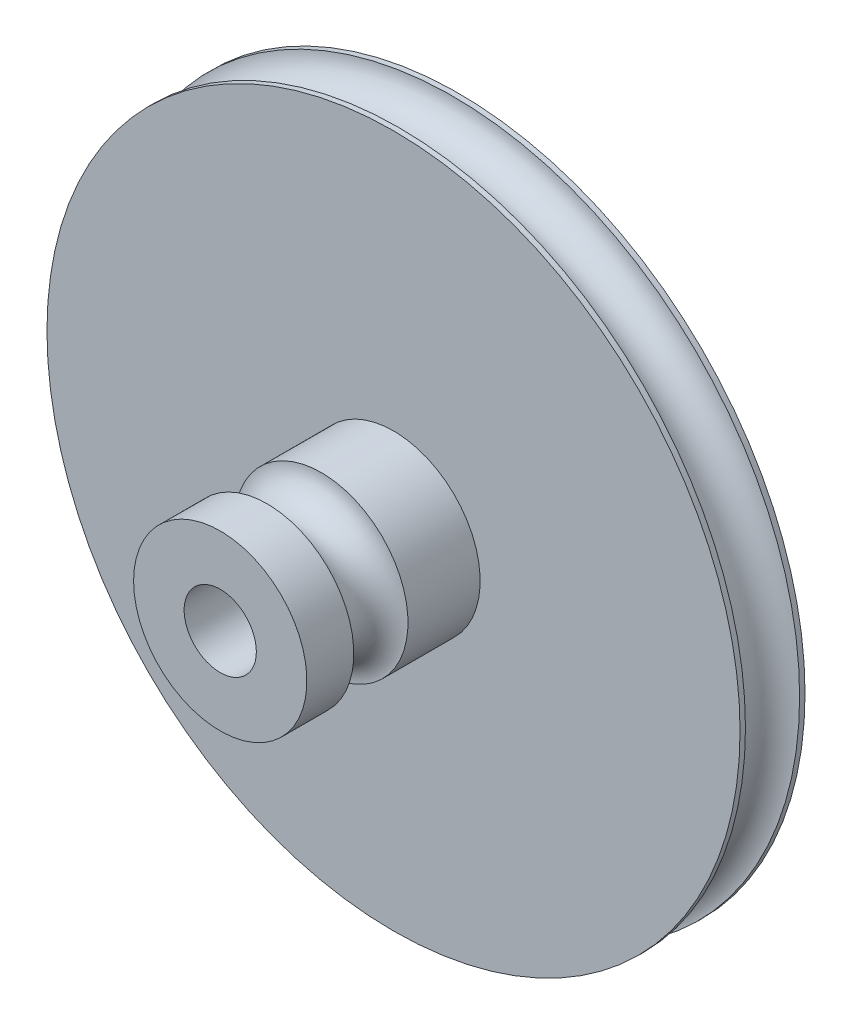
ISO-10303-21;
HEADER;
FILE_DESCRIPTION(('STEP AP214'),'2;1');
FILE_NAME('part.step','',(''),(''),'','','');
FILE_SCHEMA(('AUTOMOTIVE_DESIGN { 1 0 10303 214 1 1 1 1 }'));
ENDSEC;
DATA;
#1=APPLICATION_CONTEXT('core data for automotive mechanical design processes');
#2=APPLICATION_PROTOCOL_DEFINITION('international standard','automotive_design',2000,#1);
#3=PRODUCT_CONTEXT('',#1,'mechanical');
#4=PRODUCT('Part','Part','',(#3));
#5=PRODUCT_RELATED_PRODUCT_CATEGORY('part','',(#4));
#6=PRODUCT_DEFINITION_FORMATION('','',#4);
#7=PRODUCT_DEFINITION_CONTEXT('part definition',#1,'design');
#8=PRODUCT_DEFINITION('design','',#6,#7);
#9=PRODUCT_DEFINITION_SHAPE('','',#8);
#10=(LENGTH_UNIT() NAMED_UNIT(*) SI_UNIT(.MILLI.,.METRE.));
#11=(NAMED_UNIT(*) PLANE_ANGLE_UNIT() SI_UNIT($,.RADIAN.));
#12=(NAMED_UNIT(*) SI_UNIT($,.STERADIAN.) SOLID_ANGLE_UNIT());
#13=UNCERTAINTY_MEASURE_WITH_UNIT(LENGTH_MEASURE(1.E-05),#10,'distance_accuracy_value','');
#14=(GEOMETRIC_REPRESENTATION_CONTEXT(3) GLOBAL_UNCERTAINTY_ASSIGNED_CONTEXT((#13)) GLOBAL_UNIT_ASSIGNED_CONTEXT((#10,
#11,#12)) REPRESENTATION_CONTEXT('',''));
#15=CARTESIAN_POINT('',(0.,0.,0.));
#16=DIRECTION('',(0.,0.,1.));
#17=DIRECTION('',(1.,0.,0.));
#18=AXIS2_PLACEMENT_3D('',#15,#16,#17);
#19=CARTESIAN_POINT('',(0.,0.,-2.2225));
#20=DIRECTION('',(0.,0.,-1.));
#21=DIRECTION('',(-1.,0.,0.));
#22=AXIS2_PLACEMENT_3D('',#19,#20,#21);
#23=CYLINDRICAL_SURFACE('',#22,15.24);
#24=CARTESIAN_POINT('',(0.,0.,-2.460625));
#25=DIRECTION('',(0.,0.,-1.));
#26=DIRECTION('',(-1.,0.,0.));
#27=AXIS2_PLACEMENT_3D('',#24,#25,#26);
#28=CIRCLE('',#27,15.24);
#29=CARTESIAN_POINT('',(-15.24,0.,-2.460625));
#30=VERTEX_POINT('',#29);
#31=EDGE_CURVE('E37',#30,#30,#28,.F.);
#32=ORIENTED_EDGE('',*,*,#31,.T.);
#33=EDGE_LOOP('',(#32));
#34=FACE_BOUND('',#33,.T.);
#35=CARTESIAN_POINT('',(0.,0.,-2.2225));
#36=DIRECTION('',(0.,0.,1.));
#37=DIRECTION('',(1.,0.,0.));
#38=AXIS2_PLACEMENT_3D('',#35,#36,#37);
#39=CIRCLE('',#38,15.24);
#40=CARTESIAN_POINT('',(15.24,0.,-2.2225));
#41=VERTEX_POINT('',#40);
#42=EDGE_CURVE('E10',#41,#41,#39,.T.);
#43=ORIENTED_EDGE('',*,*,#42,.F.);
#44=EDGE_LOOP('',(#43));
#45=FACE_BOUND('',#44,.T.);
#46=ADVANCED_FACE('F33',(#34,#45),#23,.T.);
#47=CARTESIAN_POINT('',(0.,0.,5.3975));
#48=DIRECTION('',(0.,0.,-1.));
#49=DIRECTION('',(-1.,0.,0.));
#50=AXIS2_PLACEMENT_3D('',#47,#48,#49);
#51=CYLINDRICAL_SURFACE('',#50,3.81);
#52=CARTESIAN_POINT('',(0.,0.,3.33375));
#53=DIRECTION('',(0.,0.,-1.));
#54=DIRECTION('',(-1.,0.,0.));
#55=AXIS2_PLACEMENT_3D('',#52,#53,#54);
#56=CIRCLE('',#55,3.81);
#57=CARTESIAN_POINT('',(-3.81,0.,3.33375));
#58=VERTEX_POINT('',#57);
#59=EDGE_CURVE('E54',#58,#58,#56,.F.);
#60=CARTESIAN_POINT('',(0.,0.,5.3975));
#61=DIRECTION('',(0.,0.,1.));
#62=DIRECTION('',(1.,0.,0.));
#63=AXIS2_PLACEMENT_3D('',#60,#61,#62);
#64=CIRCLE('',#63,3.81);
#65=CARTESIAN_POINT('',(-3.81,0.,5.3975));
#66=VERTEX_POINT('',#65);
#67=EDGE_CURVE('E101',#66,#66,#64,.T.);
#68=CARTESIAN_POINT('',(-3.81,0.,3.33375));
#69=CARTESIAN_POINT('',(-3.81,0.,3.35524739583333));
#70=CARTESIAN_POINT('',(-3.81,0.,3.37674479166667));
#71=CARTESIAN_POINT('',(-3.81,0.,3.41973958333333));
#72=CARTESIAN_POINT('',(-3.81,0.,3.44123697916667));
#73=CARTESIAN_POINT('',(-3.81,0.,3.48423177083333));
#74=CARTESIAN_POINT('',(-3.81,0.,3.50572916666667));
#75=CARTESIAN_POINT('',(-3.81,0.,3.54872395833333));
#76=CARTESIAN_POINT('',(-3.81,0.,3.57022135416667));
#77=CARTESIAN_POINT('',(-3.81,0.,3.61321614583333));
#78=CARTESIAN_POINT('',(-3.81,0.,3.63471354166667));
#79=CARTESIAN_POINT('',(-3.81,0.,3.67770833333333));
#80=CARTESIAN_POINT('',(-3.81,0.,3.69920572916667));
#81=CARTESIAN_POINT('',(-3.81,0.,3.74220052083333));
#82=CARTESIAN_POINT('',(-3.81,0.,3.76369791666667));
#83=CARTESIAN_POINT('',(-3.81,0.,3.80669270833333));
#84=CARTESIAN_POINT('',(-3.81,0.,3.82819010416667));
#85=CARTESIAN_POINT('',(-3.81,0.,3.87118489583333));
#86=CARTESIAN_POINT('',(-3.81,0.,3.89268229166667));
#87=CARTESIAN_POINT('',(-3.81,0.,3.93567708333333));
#88=CARTESIAN_POINT('',(-3.81,0.,3.95717447916667));
#89=CARTESIAN_POINT('',(-3.81,0.,4.00016927083333));
#90=CARTESIAN_POINT('',(-3.81,0.,4.02166666666667));
#91=CARTESIAN_POINT('',(-3.81,0.,4.06466145833333));
#92=CARTESIAN_POINT('',(-3.81,0.,4.08615885416667));
#93=CARTESIAN_POINT('',(-3.81,0.,4.12915364583333));
#94=CARTESIAN_POINT('',(-3.81,0.,4.15065104166667));
#95=CARTESIAN_POINT('',(-3.81,0.,4.19364583333333));
#96=CARTESIAN_POINT('',(-3.81,0.,4.21514322916666));
#97=CARTESIAN_POINT('',(-3.81,0.,4.25813802083333));
#98=CARTESIAN_POINT('',(-3.81,0.,4.27963541666667));
#99=CARTESIAN_POINT('',(-3.81,0.,4.32263020833333));
#100=CARTESIAN_POINT('',(-3.81,0.,4.34412760416667));
#101=CARTESIAN_POINT('',(-3.81,0.,4.38712239583333));
#102=CARTESIAN_POINT('',(-3.81,0.,4.40861979166667));
#103=CARTESIAN_POINT('',(-3.81,0.,4.45161458333333));
#104=CARTESIAN_POINT('',(-3.81,0.,4.47311197916667));
#105=CARTESIAN_POINT('',(-3.81,0.,4.51610677083333));
#106=CARTESIAN_POINT('',(-3.81,0.,4.53760416666667));
#107=CARTESIAN_POINT('',(-3.81,0.,4.58059895833333));
#108=CARTESIAN_POINT('',(-3.81,0.,4.60209635416666));
#109=CARTESIAN_POINT('',(-3.81,0.,4.64509114583333));
#110=CARTESIAN_POINT('',(-3.81,0.,4.66658854166666));
#111=CARTESIAN_POINT('',(-3.81,0.,4.70958333333333));
#112=CARTESIAN_POINT('',(-3.81,0.,4.73108072916667));
#113=CARTESIAN_POINT('',(-3.81,0.,4.77407552083333));
#114=CARTESIAN_POINT('',(-3.81,0.,4.79557291666667));
#115=CARTESIAN_POINT('',(-3.81,0.,4.83856770833333));
#116=CARTESIAN_POINT('',(-3.81,0.,4.86006510416667));
#117=CARTESIAN_POINT('',(-3.81,0.,4.90305989583333));
#118=CARTESIAN_POINT('',(-3.81,0.,4.92455729166667));
#119=CARTESIAN_POINT('',(-3.81,0.,4.96755208333333));
#120=CARTESIAN_POINT('',(-3.81,0.,4.98904947916667));
#121=CARTESIAN_POINT('',(-3.81,0.,5.03204427083333));
#122=CARTESIAN_POINT('',(-3.81,0.,5.05354166666666));
#123=CARTESIAN_POINT('',(-3.81,0.,5.09653645833333));
#124=CARTESIAN_POINT('',(-3.81,0.,5.11803385416667));
#125=CARTESIAN_POINT('',(-3.81,0.,5.16102864583333));
#126=CARTESIAN_POINT('',(-3.81,0.,5.18252604166666));
#127=CARTESIAN_POINT('',(-3.81,0.,5.22552083333333));
#128=CARTESIAN_POINT('',(-3.81,0.,5.24701822916666));
#129=CARTESIAN_POINT('',(-3.81,0.,5.29001302083333));
#130=CARTESIAN_POINT('',(-3.81,0.,5.31151041666666));
#131=CARTESIAN_POINT('',(-3.81,0.,5.35450520833333));
#132=CARTESIAN_POINT('',(-3.81,0.,5.37600260416666));
#133=CARTESIAN_POINT('',(-3.81,0.,5.3975));
#134=B_SPLINE_CURVE_WITH_KNOTS('',3,(#68,#69,#70,#71,#72,#73,#74,#75,#76,#77,#78,#79,#80,#81,
#82,#83,#84,#85,#86,#87,#88,#89,#90,#91,#92,#93,#94,#95,#96,#97,#98,#99,#100,#101,#102,#103,
#104,#105,#106,#107,#108,#109,#110,#111,#112,#113,#114,#115,#116,#117,#118,#119,#120,#121,#122,
#123,#124,#125,#126,#127,#128,#129,#130,#131,#132,#133),.UNSPECIFIED.,.F.,.F.,(4,2,2,2,2,2,2,2,
2,2,2,2,2,2,2,2,2,2,2,2,2,2,2,2,2,2,2,2,2,2,2,2,4),(0.,0.0644921875000001,0.128984375,
0.1934765625,0.25796875,0.3224609375,0.386953124999999,0.451445312499999,0.515937499999999,
0.5804296875,0.644921875,0.7094140625,0.77390625,0.838398437499999,0.902890624999999,
0.967382812499999,1.031875,1.0963671875,1.160859375,1.2253515625,1.28984375,1.3543359375,
1.418828125,1.4833203125,1.5478125,1.6123046875,1.676796875,1.7412890625,1.80578125,
1.8702734375,1.934765625,1.9992578125,2.06375),.UNSPECIFIED.);
#135=EDGE_CURVE('BSEAM78',#58,#66,#134,.T.);
#136=ORIENTED_EDGE('',*,*,#59,.T.);
#137=ORIENTED_EDGE('',*,*,#67,.F.);
#138=ORIENTED_EDGE('',*,*,#135,.T.);
#139=ORIENTED_EDGE('',*,*,#135,.F.);
#140=EDGE_LOOP('',(#136,#138,#137,#139));
#141=FACE_BOUND('',#140,.T.);
#142=ADVANCED_FACE('F78',(#141),#51,.T.);
#143=CARTESIAN_POINT('',(0.,0.,-2.2225));
#144=DIRECTION('',(0.,0.,1.));
#145=DIRECTION('',(1.,0.,0.));
#146=AXIS2_PLACEMENT_3D('',#143,#144,#145);
#147=PLANE('',#146);
#148=ORIENTED_EDGE('',*,*,#42,.T.);
#149=EDGE_LOOP('',(#148));
#150=FACE_BOUND('',#149,.T.);
#151=CARTESIAN_POINT('',(0.,0.,-2.2225));
#152=DIRECTION('',(0.,0.,1.));
#153=DIRECTION('',(1.,0.,0.));
#154=AXIS2_PLACEMENT_3D('',#151,#152,#153);
#155=CIRCLE('',#154,3.81);
#156=CARTESIAN_POINT('',(-3.81,0.,-2.2225));
#157=VERTEX_POINT('',#156);
#158=EDGE_CURVE('E103',#157,#157,#155,.T.);
#159=ORIENTED_EDGE('',*,*,#158,.F.);
#160=EDGE_LOOP('',(#159));
#161=FACE_BOUND('',#160,.T.);
#162=ADVANCED_FACE('F82',(#150,#161),#147,.T.);
#163=CARTESIAN_POINT('',(0.,0.,-5.08));
#164=DIRECTION('',(0.,0.,1.));
#165=DIRECTION('',(1.,0.,0.));
#166=AXIS2_PLACEMENT_3D('',#163,#164,#165);
#167=PLANE('',#166);
#168=CARTESIAN_POINT('',(0.,0.,-5.08));
#169=DIRECTION('',(0.,0.,1.));
#170=DIRECTION('',(1.,0.,0.));
#171=AXIS2_PLACEMENT_3D('',#168,#169,#170);
#172=CIRCLE('',#171,15.24);
#173=CARTESIAN_POINT('',(15.24,0.,-5.08));
#174=VERTEX_POINT('',#173);
#175=EDGE_CURVE('E41',#174,#174,#172,.T.);
#176=ORIENTED_EDGE('',*,*,#175,.F.);
#177=EDGE_LOOP('',(#176));
#178=FACE_BOUND('',#177,.T.);
#179=CARTESIAN_POINT('',(0.,0.,-5.08));
#180=DIRECTION('',(0.,0.,1.));
#181=DIRECTION('',(1.,0.,0.));
#182=AXIS2_PLACEMENT_3D('',#179,#180,#181);
#183=CIRCLE('',#182,1.5875);
#184=CARTESIAN_POINT('',(1.5875,0.,-5.08));
#185=VERTEX_POINT('',#184);
#186=EDGE_CURVE('E46',#185,#185,#183,.T.);
#187=ORIENTED_EDGE('',*,*,#186,.T.);
#188=EDGE_LOOP('',(#187));
#189=FACE_BOUND('',#188,.T.);
#190=ADVANCED_FACE('F87',(#178,#189),#167,.F.);
#191=CARTESIAN_POINT('',(0.,0.,-4.841875));
#192=DIRECTION('',(0.,0.,1.));
#193=DIRECTION('',(1.,0.,0.));
#194=AXIS2_PLACEMENT_3D('',#191,#192,#193);
#195=CIRCLE('',#194,15.24);
#196=CARTESIAN_POINT('',(15.24,0.,-4.841875));
#197=VERTEX_POINT('',#196);
#198=EDGE_CURVE('E57',#197,#197,#195,.F.);
#199=ORIENTED_EDGE('',*,*,#198,.T.);
#200=EDGE_LOOP('',(#199));
#201=FACE_BOUND('',#200,.T.);
#202=ORIENTED_EDGE('',*,*,#175,.T.);
#203=EDGE_LOOP('',(#202));
#204=FACE_BOUND('',#203,.T.);
#205=ADVANCED_FACE('F35',(#201,#204),#23,.T.);
#206=CARTESIAN_POINT('',(0.,0.,-2.2225));
#207=DIRECTION('',(0.,0.,-1.));
#208=DIRECTION('',(-1.,0.,0.));
#209=AXIS2_PLACEMENT_3D('',#206,#207,#208);
#210=CYLINDRICAL_SURFACE('',#209,1.5875);
#211=ORIENTED_EDGE('',*,*,#186,.F.);
#212=EDGE_LOOP('',(#211));
#213=FACE_BOUND('',#212,.T.);
#214=CARTESIAN_POINT('',(0.,0.,5.3975));
#215=DIRECTION('',(0.,0.,1.));
#216=DIRECTION('',(1.,0.,0.));
#217=AXIS2_PLACEMENT_3D('',#214,#215,#216);
#218=CIRCLE('',#217,1.5875);
#219=CARTESIAN_POINT('',(1.5875,0.,5.3975));
#220=VERTEX_POINT('',#219);
#221=EDGE_CURVE('E56',#220,#220,#218,.T.);
#222=ORIENTED_EDGE('',*,*,#221,.T.);
#223=EDGE_LOOP('',(#222));
#224=FACE_BOUND('',#223,.T.);
#225=ADVANCED_FACE('F86',(#213,#224),#210,.F.);
#226=CARTESIAN_POINT('',(0.,0.,5.3975));
#227=DIRECTION('',(0.,0.,1.));
#228=DIRECTION('',(1.,0.,0.));
#229=AXIS2_PLACEMENT_3D('',#226,#227,#228);
#230=PLANE('',#229);
#231=ORIENTED_EDGE('',*,*,#67,.T.);
#232=EDGE_LOOP('',(#231));
#233=FACE_BOUND('',#232,.T.);
#234=ORIENTED_EDGE('',*,*,#221,.F.);
#235=EDGE_LOOP('',(#234));
#236=FACE_BOUND('',#235,.T.);
#237=ADVANCED_FACE('F92',(#233,#236),#230,.T.);
#238=CARTESIAN_POINT('',(0.,0.,0.952499999999998));
#239=DIRECTION('',(0.,0.,1.));
#240=DIRECTION('',(1.,0.,0.));
#241=AXIS2_PLACEMENT_3D('',#238,#239,#240);
#242=CIRCLE('',#241,3.81);
#243=CARTESIAN_POINT('',(-3.81,0.,0.952499999999998));
#244=VERTEX_POINT('',#243);
#245=EDGE_CURVE('E51',#244,#244,#242,.F.);
#246=CARTESIAN_POINT('',(-3.81,0.,0.952499999999998));
#247=CARTESIAN_POINT('',(-3.81,0.,0.919427083333332));
#248=CARTESIAN_POINT('',(-3.81,0.,0.886354166666665));
#249=CARTESIAN_POINT('',(-3.81,0.,0.820208333333332));
#250=CARTESIAN_POINT('',(-3.81,0.,0.787135416666665));
#251=CARTESIAN_POINT('',(-3.81,0.,0.720989583333332));
#252=CARTESIAN_POINT('',(-3.81,0.,0.687916666666665));
#253=CARTESIAN_POINT('',(-3.81,0.,0.621770833333332));
#254=CARTESIAN_POINT('',(-3.81,0.,0.588697916666665));
#255=CARTESIAN_POINT('',(-3.81,0.,0.522552083333332));
#256=CARTESIAN_POINT('',(-3.81,0.,0.489479166666665));
#257=CARTESIAN_POINT('',(-3.81,0.,0.423333333333332));
#258=CARTESIAN_POINT('',(-3.81,0.,0.390260416666665));
#259=CARTESIAN_POINT('',(-3.81,0.,0.324114583333332));
#260=CARTESIAN_POINT('',(-3.81,0.,0.291041666666665));
#261=CARTESIAN_POINT('',(-3.81,0.,0.224895833333332));
#262=CARTESIAN_POINT('',(-3.81,0.,0.191822916666666));
#263=CARTESIAN_POINT('',(-3.81,0.,0.125677083333332));
#264=CARTESIAN_POINT('',(-3.81,0.,0.0926041666666656));
#265=CARTESIAN_POINT('',(-3.81,0.,0.026458333333332));
#266=CARTESIAN_POINT('',(-3.81,0.,-0.00661458333333474));
#267=CARTESIAN_POINT('',(-3.81,0.,-0.072760416666668));
#268=CARTESIAN_POINT('',(-3.81,0.,-0.105833333333335));
#269=CARTESIAN_POINT('',(-3.81,0.,-0.171979166666668));
#270=CARTESIAN_POINT('',(-3.81,0.,-0.205052083333335));
#271=CARTESIAN_POINT('',(-3.81,0.,-0.271197916666668));
#272=CARTESIAN_POINT('',(-3.81,0.,-0.304270833333334));
#273=CARTESIAN_POINT('',(-3.81,0.,-0.370416666666668));
#274=CARTESIAN_POINT('',(-3.81,0.,-0.403489583333334));
#275=CARTESIAN_POINT('',(-3.81,0.,-0.469635416666668));
#276=CARTESIAN_POINT('',(-3.81,0.,-0.502708333333334));
#277=CARTESIAN_POINT('',(-3.81,0.,-0.568854166666667));
#278=CARTESIAN_POINT('',(-3.81,0.,-0.601927083333334));
#279=CARTESIAN_POINT('',(-3.81,0.,-0.668072916666668));
#280=CARTESIAN_POINT('',(-3.81,0.,-0.701145833333335));
#281=CARTESIAN_POINT('',(-3.81,0.,-0.767291666666668));
#282=CARTESIAN_POINT('',(-3.81,0.,-0.800364583333334));
#283=CARTESIAN_POINT('',(-3.81,0.,-0.866510416666668));
#284=CARTESIAN_POINT('',(-3.81,0.,-0.899583333333334));
#285=CARTESIAN_POINT('',(-3.81,0.,-0.965729166666668));
#286=CARTESIAN_POINT('',(-3.81,0.,-0.998802083333334));
#287=CARTESIAN_POINT('',(-3.81,0.,-1.06494791666667));
#288=CARTESIAN_POINT('',(-3.81,0.,-1.09802083333333));
#289=CARTESIAN_POINT('',(-3.81,0.,-1.16416666666667));
#290=CARTESIAN_POINT('',(-3.81,0.,-1.19723958333333));
#291=CARTESIAN_POINT('',(-3.81,0.,-1.26338541666667));
#292=CARTESIAN_POINT('',(-3.81,0.,-1.29645833333333));
#293=CARTESIAN_POINT('',(-3.81,0.,-1.36260416666667));
#294=CARTESIAN_POINT('',(-3.81,0.,-1.39567708333333));
#295=CARTESIAN_POINT('',(-3.81,0.,-1.46182291666667));
#296=CARTESIAN_POINT('',(-3.81,0.,-1.49489583333333));
#297=CARTESIAN_POINT('',(-3.81,0.,-1.56104166666667));
#298=CARTESIAN_POINT('',(-3.81,0.,-1.59411458333333));
#299=CARTESIAN_POINT('',(-3.81,0.,-1.66026041666667));
#300=CARTESIAN_POINT('',(-3.81,0.,-1.69333333333333));
#301=CARTESIAN_POINT('',(-3.81,0.,-1.75947916666667));
#302=CARTESIAN_POINT('',(-3.81,0.,-1.79255208333333));
#303=CARTESIAN_POINT('',(-3.81,0.,-1.85869791666667));
#304=CARTESIAN_POINT('',(-3.81,0.,-1.89177083333333));
#305=CARTESIAN_POINT('',(-3.81,0.,-1.95791666666667));
#306=CARTESIAN_POINT('',(-3.81,0.,-1.99098958333333));
#307=CARTESIAN_POINT('',(-3.81,0.,-2.05713541666667));
#308=CARTESIAN_POINT('',(-3.81,0.,-2.09020833333333));
#309=CARTESIAN_POINT('',(-3.81,0.,-2.15635416666667));
#310=CARTESIAN_POINT('',(-3.81,0.,-2.18942708333333));
#311=CARTESIAN_POINT('',(-3.81,0.,-2.2225));
#312=B_SPLINE_CURVE_WITH_KNOTS('',3,(#246,#247,#248,#249,#250,#251,#252,#253,#254,#255,#256,
#257,#258,#259,#260,#261,#262,#263,#264,#265,#266,#267,#268,#269,#270,#271,#272,#273,#274,#275,
#276,#277,#278,#279,#280,#281,#282,#283,#284,#285,#286,#287,#288,#289,#290,#291,#292,#293,#294,
#295,#296,#297,#298,#299,#300,#301,#302,#303,#304,#305,#306,#307,#308,#309,#310,#311),
.UNSPECIFIED.,.F.,.F.,(4,2,2,2,2,2,2,2,2,2,2,2,2,2,2,2,2,2,2,2,2,2,2,2,2,2,2,2,2,2,2,2,4),(0.,
0.0992187500000004,0.1984375,0.29765625,0.396875,0.49609375,0.595312499999999,0.69453125,
0.793749999999999,0.89296875,0.9921875,1.09140625,1.190625,1.28984375,1.3890625,1.48828125,
1.5875,1.68671875,1.7859375,1.88515625,1.984375,2.08359375,2.1828125,2.28203125,2.38125,
2.48046875,2.5796875,2.67890625,2.778125,2.87734375,2.9765625,3.07578125,3.175),.UNSPECIFIED.);
#313=EDGE_CURVE('BSEAM74',#244,#157,#312,.T.);
#314=ORIENTED_EDGE('',*,*,#245,.T.);
#315=ORIENTED_EDGE('',*,*,#158,.T.);
#316=ORIENTED_EDGE('',*,*,#313,.T.);
#317=ORIENTED_EDGE('',*,*,#313,.F.);
#318=EDGE_LOOP('',(#314,#316,#315,#317));
#319=FACE_BOUND('',#318,.T.);
#320=ADVANCED_FACE('F74',(#319),#51,.T.);
#321=CARTESIAN_POINT('',(0.,0.,2.143125));
#322=DIRECTION('',(0.,0.,1.));
#323=DIRECTION('',(1.,0.,0.));
#324=AXIS2_PLACEMENT_3D('',#321,#322,#323);
#325=TOROIDAL_SURFACE('',#324,3.81,1.190625);
#326=ORIENTED_EDGE('',*,*,#245,.F.);
#327=EDGE_LOOP('',(#326));
#328=FACE_BOUND('',#327,.T.);
#329=ORIENTED_EDGE('',*,*,#59,.F.);
#330=EDGE_LOOP('',(#329));
#331=FACE_BOUND('',#330,.T.);
#332=ADVANCED_FACE('F68',(#328,#331),#325,.F.);
#333=CARTESIAN_POINT('',(0.,0.,-3.65125));
#334=DIRECTION('',(0.,0.,1.));
#335=DIRECTION('',(1.,0.,0.));
#336=AXIS2_PLACEMENT_3D('',#333,#334,#335);
#337=TOROIDAL_SURFACE('',#336,15.24,1.190625);
#338=ORIENTED_EDGE('',*,*,#198,.F.);
#339=EDGE_LOOP('',(#338));
#340=FACE_BOUND('',#339,.T.);
#341=ORIENTED_EDGE('',*,*,#31,.F.);
#342=EDGE_LOOP('',(#341));
#343=FACE_BOUND('',#342,.T.);
#344=ADVANCED_FACE('F66',(#340,#343),#337,.F.);
#345=CLOSED_SHELL('',(#46,#142,#162,#190,#205,#225,#237,#320,#332,#344));
#346=MANIFOLD_SOLID_BREP('B2',#345);
#347=ADVANCED_BREP_SHAPE_REPRESENTATION('',(#18,#346),#14);
#348=SHAPE_DEFINITION_REPRESENTATION(#9,#347);
ENDSEC;
END-ISO-10303-21;
